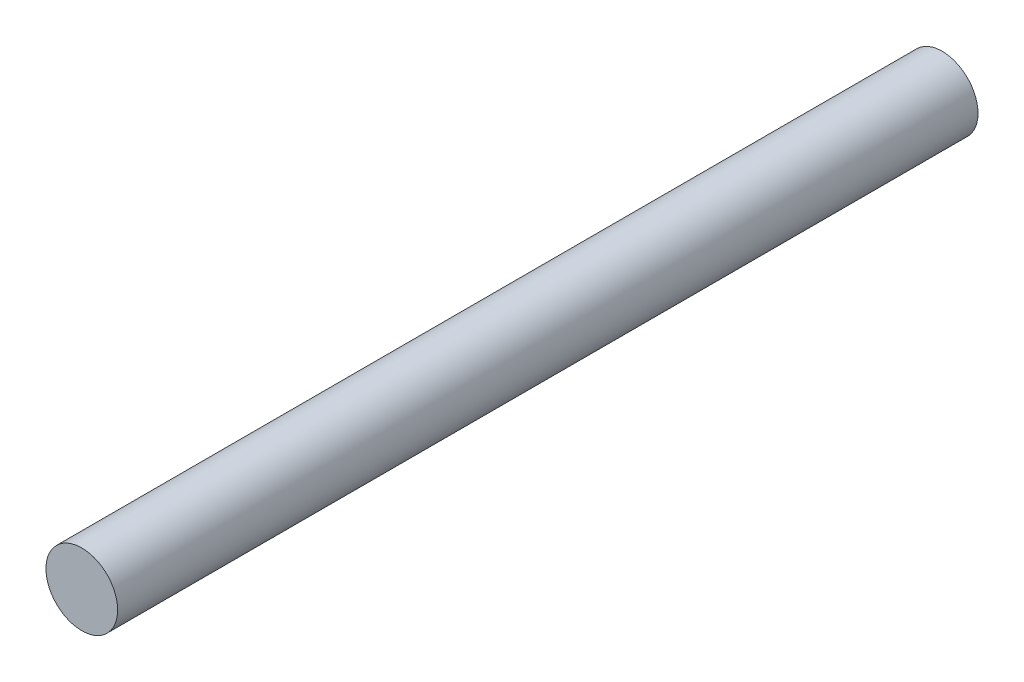
ISO-10303-21;
HEADER;
FILE_DESCRIPTION(('STEP AP214'),'2;1');
FILE_NAME('part.step','',(''),(''),'','','');
FILE_SCHEMA(('AUTOMOTIVE_DESIGN { 1 0 10303 214 1 1 1 1 }'));
ENDSEC;
DATA;
#1=APPLICATION_CONTEXT('core data for automotive mechanical design processes');
#2=APPLICATION_PROTOCOL_DEFINITION('international standard','automotive_design',2000,#1);
#3=PRODUCT_CONTEXT('',#1,'mechanical');
#4=PRODUCT('Part','Part','',(#3));
#5=PRODUCT_RELATED_PRODUCT_CATEGORY('part','',(#4));
#6=PRODUCT_DEFINITION_FORMATION('','',#4);
#7=PRODUCT_DEFINITION_CONTEXT('part definition',#1,'design');
#8=PRODUCT_DEFINITION('design','',#6,#7);
#9=PRODUCT_DEFINITION_SHAPE('','',#8);
#10=(LENGTH_UNIT() NAMED_UNIT(*) SI_UNIT(.MILLI.,.METRE.));
#11=(NAMED_UNIT(*) PLANE_ANGLE_UNIT() SI_UNIT($,.RADIAN.));
#12=(NAMED_UNIT(*) SI_UNIT($,.STERADIAN.) SOLID_ANGLE_UNIT());
#13=UNCERTAINTY_MEASURE_WITH_UNIT(LENGTH_MEASURE(1.E-05),#10,'distance_accuracy_value','');
#14=(GEOMETRIC_REPRESENTATION_CONTEXT(3) GLOBAL_UNCERTAINTY_ASSIGNED_CONTEXT((#13)) GLOBAL_UNIT_ASSIGNED_CONTEXT((#10,
#11,#12)) REPRESENTATION_CONTEXT('',''));
#15=CARTESIAN_POINT('',(0.,0.,0.));
#16=DIRECTION('',(0.,0.,1.));
#17=DIRECTION('',(1.,0.,0.));
#18=AXIS2_PLACEMENT_3D('',#15,#16,#17);
#19=CARTESIAN_POINT('',(0.,0.,48.));
#20=DIRECTION('',(0.,0.,-1.));
#21=DIRECTION('',(-1.,0.,0.));
#22=AXIS2_PLACEMENT_3D('',#19,#20,#21);
#23=CYLINDRICAL_SURFACE('',#22,2.);
#24=CARTESIAN_POINT('',(0.,0.,48.));
#25=DIRECTION('',(0.,0.,1.));
#26=DIRECTION('',(1.,0.,0.));
#27=AXIS2_PLACEMENT_3D('',#24,#25,#26);
#28=CIRCLE('',#27,2.);
#29=CARTESIAN_POINT('',(2.,0.,48.));
#30=VERTEX_POINT('',#29);
#31=EDGE_CURVE('E10',#30,#30,#28,.T.);
#32=ORIENTED_EDGE('',*,*,#31,.F.);
#33=EDGE_LOOP('',(#32));
#34=FACE_BOUND('',#33,.T.);
#35=CARTESIAN_POINT('',(0.,0.,0.));
#36=DIRECTION('',(0.,0.,1.));
#37=DIRECTION('',(1.,0.,0.));
#38=AXIS2_PLACEMENT_3D('',#35,#36,#37);
#39=CIRCLE('',#38,2.);
#40=CARTESIAN_POINT('',(2.,0.,0.));
#41=VERTEX_POINT('',#40);
#42=EDGE_CURVE('E38',#41,#41,#39,.T.);
#43=ORIENTED_EDGE('',*,*,#42,.T.);
#44=EDGE_LOOP('',(#43));
#45=FACE_BOUND('',#44,.T.);
#46=ADVANCED_FACE('F35',(#34,#45),#23,.T.);
#47=CARTESIAN_POINT('',(0.,0.,48.));
#48=DIRECTION('',(0.,0.,1.));
#49=DIRECTION('',(1.,0.,0.));
#50=AXIS2_PLACEMENT_3D('',#47,#48,#49);
#51=PLANE('',#50);
#52=ORIENTED_EDGE('',*,*,#31,.T.);
#53=EDGE_LOOP('',(#52));
#54=FACE_BOUND('',#53,.T.);
#55=ADVANCED_FACE('F50',(#54),#51,.T.);
#56=CARTESIAN_POINT('',(0.,0.,0.));
#57=DIRECTION('',(0.,0.,1.));
#58=DIRECTION('',(1.,0.,0.));
#59=AXIS2_PLACEMENT_3D('',#56,#57,#58);
#60=PLANE('',#59);
#61=ORIENTED_EDGE('',*,*,#42,.F.);
#62=EDGE_LOOP('',(#61));
#63=FACE_BOUND('',#62,.T.);
#64=ADVANCED_FACE('F48',(#63),#60,.F.);
#65=CLOSED_SHELL('',(#46,#55,#64));
#66=MANIFOLD_SOLID_BREP('B2',#65);
#67=ADVANCED_BREP_SHAPE_REPRESENTATION('',(#18,#66),#14);
#68=SHAPE_DEFINITION_REPRESENTATION(#9,#67);
ENDSEC;
END-ISO-10303-21;
